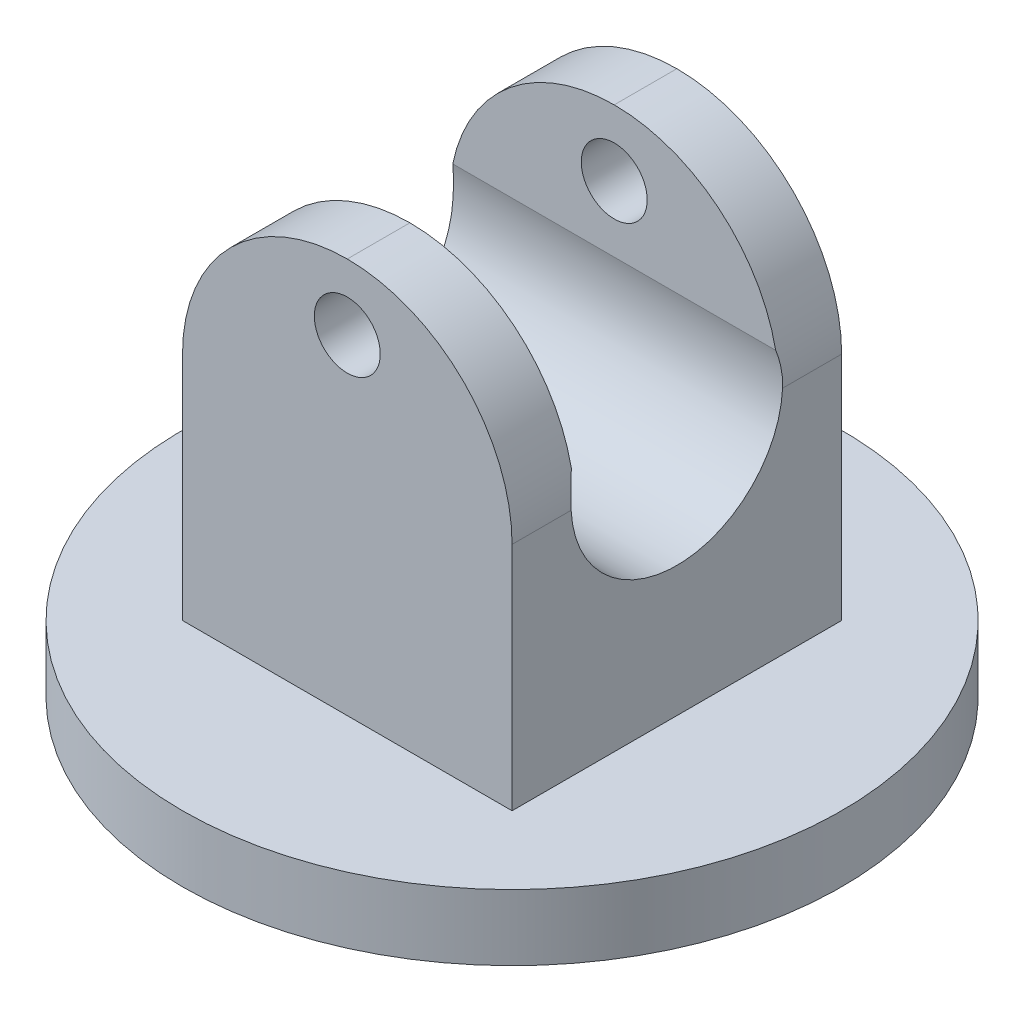
ISO-10303-21;
HEADER;
FILE_DESCRIPTION(('STEP AP214'),'2;1');
FILE_NAME('part.step','',(''),(''),'','','');
FILE_SCHEMA(('AUTOMOTIVE_DESIGN { 1 0 10303 214 1 1 1 1 }'));
ENDSEC;
DATA;
#1=APPLICATION_CONTEXT('core data for automotive mechanical design processes');
#2=APPLICATION_PROTOCOL_DEFINITION('international standard','automotive_design',2000,#1);
#3=PRODUCT_CONTEXT('',#1,'mechanical');
#4=PRODUCT('Part','Part','',(#3));
#5=PRODUCT_RELATED_PRODUCT_CATEGORY('part','',(#4));
#6=PRODUCT_DEFINITION_FORMATION('','',#4);
#7=PRODUCT_DEFINITION_CONTEXT('part definition',#1,'design');
#8=PRODUCT_DEFINITION('design','',#6,#7);
#9=PRODUCT_DEFINITION_SHAPE('','',#8);
#10=(LENGTH_UNIT() NAMED_UNIT(*) SI_UNIT(.MILLI.,.METRE.));
#11=(NAMED_UNIT(*) PLANE_ANGLE_UNIT() SI_UNIT($,.RADIAN.));
#12=(NAMED_UNIT(*) SI_UNIT($,.STERADIAN.) SOLID_ANGLE_UNIT());
#13=UNCERTAINTY_MEASURE_WITH_UNIT(LENGTH_MEASURE(1.E-05),#10,'distance_accuracy_value','');
#14=(GEOMETRIC_REPRESENTATION_CONTEXT(3) GLOBAL_UNCERTAINTY_ASSIGNED_CONTEXT((#13)) GLOBAL_UNIT_ASSIGNED_CONTEXT((#10,
#11,#12)) REPRESENTATION_CONTEXT('',''));
#15=CARTESIAN_POINT('',(0.,0.,0.));
#16=DIRECTION('',(0.,0.,1.));
#17=DIRECTION('',(1.,0.,0.));
#18=AXIS2_PLACEMENT_3D('',#15,#16,#17);
#19=CARTESIAN_POINT('',(0.,10.,0.));
#20=DIRECTION('',(0.,-1.,0.));
#21=DIRECTION('',(0.,0.,-1.));
#22=AXIS2_PLACEMENT_3D('',#19,#20,#21);
#23=CYLINDRICAL_SURFACE('',#22,50.);
#24=CARTESIAN_POINT('',(0.,10.,0.));
#25=DIRECTION('',(0.,1.,0.));
#26=DIRECTION('',(0.,0.,1.));
#27=AXIS2_PLACEMENT_3D('',#24,#25,#26);
#28=CIRCLE('',#27,50.);
#29=CARTESIAN_POINT('',(0.,10.,50.));
#30=VERTEX_POINT('',#29);
#31=EDGE_CURVE('E154',#30,#30,#28,.T.);
#32=ORIENTED_EDGE('',*,*,#31,.F.);
#33=EDGE_LOOP('',(#32));
#34=FACE_BOUND('',#33,.T.);
#35=CARTESIAN_POINT('',(0.,0.,0.));
#36=DIRECTION('',(0.,1.,0.));
#37=DIRECTION('',(0.,0.,1.));
#38=AXIS2_PLACEMENT_3D('',#35,#36,#37);
#39=CIRCLE('',#38,50.);
#40=CARTESIAN_POINT('',(0.,0.,50.));
#41=VERTEX_POINT('',#40);
#42=EDGE_CURVE('E153',#41,#41,#39,.T.);
#43=ORIENTED_EDGE('',*,*,#42,.T.);
#44=EDGE_LOOP('',(#43));
#45=FACE_BOUND('',#44,.T.);
#46=ADVANCED_FACE('F38',(#34,#45),#23,.T.);
#47=CARTESIAN_POINT('',(0.,10.,0.));
#48=DIRECTION('',(0.,1.,0.));
#49=DIRECTION('',(0.,0.,1.));
#50=AXIS2_PLACEMENT_3D('',#47,#48,#49);
#51=PLANE('',#50);
#52=DIRECTION('',(0.,0.,-1.));
#53=VECTOR('',#52,1.);
#54=CARTESIAN_POINT('',(25.,10.,25.));
#55=LINE('',#54,#53);
#56=CARTESIAN_POINT('',(25.,10.,25.));
#57=VERTEX_POINT('',#56);
#58=CARTESIAN_POINT('',(25.,10.,-25.));
#59=VERTEX_POINT('',#58);
#60=EDGE_CURVE('E142',#57,#59,#55,.T.);
#61=ORIENTED_EDGE('',*,*,#60,.F.);
#62=DIRECTION('',(1.,0.,0.));
#63=VECTOR('',#62,1.);
#64=CARTESIAN_POINT('',(-25.,10.,25.));
#65=LINE('',#64,#63);
#66=CARTESIAN_POINT('',(-25.,10.,25.));
#67=VERTEX_POINT('',#66);
#68=EDGE_CURVE('E138',#67,#57,#65,.T.);
#69=ORIENTED_EDGE('',*,*,#68,.F.);
#70=DIRECTION('',(0.,0.,1.));
#71=VECTOR('',#70,1.);
#72=CARTESIAN_POINT('',(-25.,10.,25.));
#73=LINE('',#72,#71);
#74=CARTESIAN_POINT('',(-25.,10.,-25.));
#75=VERTEX_POINT('',#74);
#76=EDGE_CURVE('E121',#75,#67,#73,.T.);
#77=ORIENTED_EDGE('',*,*,#76,.F.);
#78=DIRECTION('',(-1.,0.,0.));
#79=VECTOR('',#78,1.);
#80=CARTESIAN_POINT('',(-25.,10.,-25.));
#81=LINE('',#80,#79);
#82=EDGE_CURVE('E135',#59,#75,#81,.T.);
#83=ORIENTED_EDGE('',*,*,#82,.F.);
#84=EDGE_LOOP('',(#61,#69,#77,#83));
#85=FACE_BOUND('',#84,.T.);
#86=ORIENTED_EDGE('',*,*,#31,.T.);
#87=EDGE_LOOP('',(#86));
#88=FACE_BOUND('',#87,.T.);
#89=ADVANCED_FACE('F133',(#85,#88),#51,.T.);
#90=CARTESIAN_POINT('',(0.,0.,0.));
#91=DIRECTION('',(0.,1.,0.));
#92=DIRECTION('',(0.,0.,1.));
#93=AXIS2_PLACEMENT_3D('',#90,#91,#92);
#94=PLANE('',#93);
#95=ORIENTED_EDGE('',*,*,#42,.F.);
#96=EDGE_LOOP('',(#95));
#97=FACE_BOUND('',#96,.T.);
#98=ADVANCED_FACE('F232',(#97),#94,.F.);
#99=CARTESIAN_POINT('',(25.,70.,25.));
#100=DIRECTION('',(-1.,0.,0.));
#101=DIRECTION('',(0.,0.,1.));
#102=AXIS2_PLACEMENT_3D('',#99,#100,#101);
#103=PLANE('',#102);
#104=CARTESIAN_POINT('',(25.,45.7870017952277,0.));
#105=DIRECTION('',(1.,0.,0.));
#106=DIRECTION('',(0.,0.,-1.));
#107=AXIS2_PLACEMENT_3D('',#104,#105,#106);
#108=CIRCLE('',#107,16.0623582911543);
#109=CARTESIAN_POINT('',(25.,45.,16.0430664789411));
#110=VERTEX_POINT('',#109);
#111=CARTESIAN_POINT('',(25.,45.,-16.0430664789411));
#112=VERTEX_POINT('',#111);
#113=EDGE_CURVE('E264',#110,#112,#108,.T.);
#114=ORIENTED_EDGE('',*,*,#113,.F.);
#115=DIRECTION('',(0.,0.,-1.));
#116=VECTOR('',#115,1.);
#117=CARTESIAN_POINT('',(25.,45.,25.));
#118=LINE('',#117,#116);
#119=CARTESIAN_POINT('',(25.,45.,25.));
#120=VERTEX_POINT('',#119);
#121=EDGE_CURVE('E262',#110,#120,#118,.F.);
#122=ORIENTED_EDGE('',*,*,#121,.T.);
#123=DIRECTION('',(0.,-1.,0.));
#124=VECTOR('',#123,1.);
#125=CARTESIAN_POINT('',(25.,70.,25.));
#126=LINE('',#125,#124);
#127=EDGE_CURVE('E149',#120,#57,#126,.T.);
#128=ORIENTED_EDGE('',*,*,#127,.T.);
#129=ORIENTED_EDGE('',*,*,#60,.T.);
#130=DIRECTION('',(0.,-1.,0.));
#131=VECTOR('',#130,1.);
#132=CARTESIAN_POINT('',(25.,70.,-25.));
#133=LINE('',#132,#131);
#134=CARTESIAN_POINT('',(25.,45.,-25.));
#135=VERTEX_POINT('',#134);
#136=EDGE_CURVE('E126',#135,#59,#133,.T.);
#137=ORIENTED_EDGE('',*,*,#136,.F.);
#138=DIRECTION('',(0.,0.,-1.));
#139=VECTOR('',#138,1.);
#140=CARTESIAN_POINT('',(25.,45.,25.));
#141=LINE('',#140,#139);
#142=EDGE_CURVE('E268',#135,#112,#141,.F.);
#143=ORIENTED_EDGE('',*,*,#142,.T.);
#144=EDGE_LOOP('',(#114,#122,#128,#129,#137,#143));
#145=FACE_BOUND('',#144,.T.);
#146=ADVANCED_FACE('F238',(#145),#103,.F.);
#147=CARTESIAN_POINT('',(-25.,70.,-25.));
#148=DIRECTION('',(0.,0.,1.));
#149=DIRECTION('',(1.,0.,0.));
#150=AXIS2_PLACEMENT_3D('',#147,#148,#149);
#151=PLANE('',#150);
#152=CARTESIAN_POINT('',(0.,60.,-25.));
#153=DIRECTION('',(0.,0.,1.));
#154=DIRECTION('',(1.,0.,0.));
#155=AXIS2_PLACEMENT_3D('',#152,#153,#154);
#156=CIRCLE('',#155,5.);
#157=CARTESIAN_POINT('',(5.,60.,-25.));
#158=VERTEX_POINT('',#157);
#159=EDGE_CURVE('E290',#158,#158,#156,.T.);
#160=ORIENTED_EDGE('',*,*,#159,.T.);
#161=EDGE_LOOP('',(#160));
#162=FACE_BOUND('',#161,.T.);
#163=DIRECTION('',(0.,-1.,0.));
#164=VECTOR('',#163,1.);
#165=CARTESIAN_POINT('',(-25.,70.,-25.));
#166=LINE('',#165,#164);
#167=CARTESIAN_POINT('',(-25.,45.,-25.));
#168=VERTEX_POINT('',#167);
#169=EDGE_CURVE('E117',#168,#75,#166,.T.);
#170=ORIENTED_EDGE('',*,*,#169,.F.);
#171=CARTESIAN_POINT('',(0.,45.,-25.));
#172=DIRECTION('',(0.,0.,1.));
#173=DIRECTION('',(1.,0.,0.));
#174=AXIS2_PLACEMENT_3D('',#171,#172,#173);
#175=CIRCLE('',#174,25.);
#176=CARTESIAN_POINT('',(0.,70.,-25.));
#177=VERTEX_POINT('',#176);
#178=EDGE_CURVE('E11',#168,#177,#175,.F.);
#179=ORIENTED_EDGE('',*,*,#178,.T.);
#180=CARTESIAN_POINT('',(0.,45.,-25.));
#181=DIRECTION('',(0.,0.,1.));
#182=DIRECTION('',(1.,0.,0.));
#183=AXIS2_PLACEMENT_3D('',#180,#181,#182);
#184=CIRCLE('',#183,25.);
#185=EDGE_CURVE('E48',#177,#135,#184,.F.);
#186=ORIENTED_EDGE('',*,*,#185,.T.);
#187=ORIENTED_EDGE('',*,*,#136,.T.);
#188=ORIENTED_EDGE('',*,*,#82,.T.);
#189=EDGE_LOOP('',(#170,#179,#186,#187,#188));
#190=FACE_BOUND('',#189,.T.);
#191=ADVANCED_FACE('F140',(#162,#190),#151,.F.);
#192=CARTESIAN_POINT('',(-25.,70.,25.));
#193=DIRECTION('',(1.,0.,0.));
#194=DIRECTION('',(0.,0.,-1.));
#195=AXIS2_PLACEMENT_3D('',#192,#193,#194);
#196=PLANE('',#195);
#197=DIRECTION('',(0.,-1.,0.));
#198=VECTOR('',#197,1.);
#199=CARTESIAN_POINT('',(-25.,70.,25.));
#200=LINE('',#199,#198);
#201=CARTESIAN_POINT('',(-25.,45.,25.));
#202=VERTEX_POINT('',#201);
#203=EDGE_CURVE('E127',#202,#67,#200,.T.);
#204=ORIENTED_EDGE('',*,*,#203,.F.);
#205=DIRECTION('',(0.,0.,1.));
#206=VECTOR('',#205,1.);
#207=CARTESIAN_POINT('',(-25.,45.,25.));
#208=LINE('',#207,#206);
#209=CARTESIAN_POINT('',(-25.,45.,16.0430664789411));
#210=VERTEX_POINT('',#209);
#211=EDGE_CURVE('E274',#202,#210,#208,.F.);
#212=ORIENTED_EDGE('',*,*,#211,.T.);
#213=CARTESIAN_POINT('',(-25.,45.7870017952277,0.));
#214=DIRECTION('',(1.,0.,0.));
#215=DIRECTION('',(0.,0.,-1.));
#216=AXIS2_PLACEMENT_3D('',#213,#214,#215);
#217=CIRCLE('',#216,16.0623582911543);
#218=CARTESIAN_POINT('',(-25.,45.,-16.0430664789411));
#219=VERTEX_POINT('',#218);
#220=EDGE_CURVE('E157',#210,#219,#217,.T.);
#221=ORIENTED_EDGE('',*,*,#220,.T.);
#222=DIRECTION('',(0.,0.,1.));
#223=VECTOR('',#222,1.);
#224=CARTESIAN_POINT('',(-25.,45.,25.));
#225=LINE('',#224,#223);
#226=EDGE_CURVE('E124',#219,#168,#225,.F.);
#227=ORIENTED_EDGE('',*,*,#226,.T.);
#228=ORIENTED_EDGE('',*,*,#169,.T.);
#229=ORIENTED_EDGE('',*,*,#76,.T.);
#230=EDGE_LOOP('',(#204,#212,#221,#227,#228,#229));
#231=FACE_BOUND('',#230,.T.);
#232=ADVANCED_FACE('F120',(#231),#196,.F.);
#233=CARTESIAN_POINT('',(-25.,70.,25.));
#234=DIRECTION('',(0.,0.,-1.));
#235=DIRECTION('',(-1.,0.,0.));
#236=AXIS2_PLACEMENT_3D('',#233,#234,#235);
#237=PLANE('',#236);
#238=CARTESIAN_POINT('',(0.,60.,25.));
#239=DIRECTION('',(0.,0.,-1.));
#240=DIRECTION('',(-1.,0.,0.));
#241=AXIS2_PLACEMENT_3D('',#238,#239,#240);
#242=CIRCLE('',#241,5.);
#243=CARTESIAN_POINT('',(-5.,60.,25.));
#244=VERTEX_POINT('',#243);
#245=EDGE_CURVE('E255',#244,#244,#242,.T.);
#246=ORIENTED_EDGE('',*,*,#245,.T.);
#247=EDGE_LOOP('',(#246));
#248=FACE_BOUND('',#247,.T.);
#249=ORIENTED_EDGE('',*,*,#127,.F.);
#250=CARTESIAN_POINT('',(0.,45.,25.));
#251=DIRECTION('',(0.,0.,-1.));
#252=DIRECTION('',(-1.,0.,0.));
#253=AXIS2_PLACEMENT_3D('',#250,#251,#252);
#254=CIRCLE('',#253,25.);
#255=CARTESIAN_POINT('',(0.,70.,25.));
#256=VERTEX_POINT('',#255);
#257=EDGE_CURVE('E257',#120,#256,#254,.F.);
#258=ORIENTED_EDGE('',*,*,#257,.T.);
#259=CARTESIAN_POINT('',(0.,45.,25.));
#260=DIRECTION('',(0.,0.,-1.));
#261=DIRECTION('',(-1.,0.,0.));
#262=AXIS2_PLACEMENT_3D('',#259,#260,#261);
#263=CIRCLE('',#262,25.);
#264=EDGE_CURVE('E267',#256,#202,#263,.F.);
#265=ORIENTED_EDGE('',*,*,#264,.T.);
#266=ORIENTED_EDGE('',*,*,#203,.T.);
#267=ORIENTED_EDGE('',*,*,#68,.T.);
#268=EDGE_LOOP('',(#249,#258,#265,#266,#267));
#269=FACE_BOUND('',#268,.T.);
#270=ADVANCED_FACE('F189',(#248,#269),#237,.F.);
#271=CARTESIAN_POINT('',(-50.,45.7870017952277,0.));
#272=DIRECTION('',(1.,0.,0.));
#273=DIRECTION('',(0.,0.,-1.));
#274=AXIS2_PLACEMENT_3D('',#271,#272,#273);
#275=CYLINDRICAL_SURFACE('',#274,16.0623582911543);
#276=DIRECTION('',(1.,0.,0.));
#277=VECTOR('',#276,1.);
#278=CARTESIAN_POINT('',(-50.,50.,15.5));
#279=LINE('',#278,#277);
#280=CARTESIAN_POINT('',(-24.4948974278318,50.,15.5));
#281=VERTEX_POINT('',#280);
#282=CARTESIAN_POINT('',(24.4948974278318,50.,15.5));
#283=VERTEX_POINT('',#282);
#284=EDGE_CURVE('E289',#281,#283,#279,.T.);
#285=ORIENTED_EDGE('',*,*,#284,.T.);
#286=CARTESIAN_POINT('',(24.4948974278318,50.,15.5));
#287=CARTESIAN_POINT('',(24.5360080640604,49.7986122084649,15.5547396782245));
#288=CARTESIAN_POINT('',(24.5748283702396,49.5957421163059,15.605664148144));
#289=CARTESIAN_POINT('',(24.6477015240305,49.1873411012421,15.6997121700656));
#290=CARTESIAN_POINT('',(24.6817540512124,48.9818100005111,15.7428351978105));
#291=CARTESIAN_POINT('',(24.7759211197461,48.3653275162349,15.8595533869517));
#292=CARTESIAN_POINT('',(24.8287682026249,47.9509621887126,15.9214574760126));
#293=CARTESIAN_POINT('',(24.9137766829401,47.1165054533366,16.0127424421074));
#294=CARTESIAN_POINT('',(24.9459365230118,46.6964136168137,16.042120870684));
#295=CARTESIAN_POINT('',(24.9782961585118,46.0630225915213,16.0613935270315));
#296=CARTESIAN_POINT('',(24.9864362736,45.8504218569248,16.063640322793));
#297=CARTESIAN_POINT('',(24.9972901245615,45.4251546226323,16.0596900891298));
#298=CARTESIAN_POINT('',(25.0000037122856,45.2124881212993,16.0534928291823));
#299=CARTESIAN_POINT('',(25.,45.,16.0430664789411));
#300=B_SPLINE_CURVE_WITH_KNOTS('',3,(#286,#287,#288,#289,#290,#291,#292,#293,#294,#295,#296,
#297,#298,#299),.UNSPECIFIED.,.F.,.F.,(4,2,2,2,2,2,4),(0.,0.638018474818265,1.27607980858665,
2.54107185784011,3.80615912632551,4.44425585207834,5.08236999822523),.UNSPECIFIED.);
#301=EDGE_CURVE('E204',#283,#110,#300,.T.);
#302=ORIENTED_EDGE('',*,*,#301,.T.);
#303=ORIENTED_EDGE('',*,*,#113,.T.);
#304=CARTESIAN_POINT('',(25.,45.,-16.0430664789411));
#305=CARTESIAN_POINT('',(25.0000037122856,45.2124881212993,-16.0534928291823));
#306=CARTESIAN_POINT('',(24.9972901245615,45.4251546226323,-16.0596900891298));
#307=CARTESIAN_POINT('',(24.9864362736,45.8504218569248,-16.063640322793));
#308=CARTESIAN_POINT('',(24.9782961585118,46.0630225915213,-16.0613935270315));
#309=CARTESIAN_POINT('',(24.9459365230118,46.6964136168137,-16.042120870684));
#310=CARTESIAN_POINT('',(24.9137766829401,47.1165054533366,-16.0127424421074));
#311=CARTESIAN_POINT('',(24.8287682026249,47.9509621887126,-15.9214574760126));
#312=CARTESIAN_POINT('',(24.7759211197461,48.3653275162349,-15.8595533869517));
#313=CARTESIAN_POINT('',(24.6817540512124,48.9818100005111,-15.7428351978105));
#314=CARTESIAN_POINT('',(24.6477015240305,49.1873411012421,-15.6997121700656));
#315=CARTESIAN_POINT('',(24.5748283702396,49.5957421163059,-15.605664148144));
#316=CARTESIAN_POINT('',(24.5360080640604,49.7986122084649,-15.5547396782245));
#317=CARTESIAN_POINT('',(24.4948974278318,50.,-15.5));
#318=B_SPLINE_CURVE_WITH_KNOTS('',3,(#304,#305,#306,#307,#308,#309,#310,#311,#312,#313,#314,
#315,#316,#317),.UNSPECIFIED.,.F.,.F.,(4,2,2,2,2,2,4),(0.,0.638114146146888,1.27621087189971,
2.54129814038511,3.80629018963856,4.44435152340695,5.08236999822522),.UNSPECIFIED.);
#319=CARTESIAN_POINT('',(24.4948974278318,50.,-15.5));
#320=VERTEX_POINT('',#319);
#321=EDGE_CURVE('E170',#112,#320,#318,.T.);
#322=ORIENTED_EDGE('',*,*,#321,.T.);
#323=DIRECTION('',(1.,0.,0.));
#324=VECTOR('',#323,1.);
#325=CARTESIAN_POINT('',(-50.,50.,-15.5));
#326=LINE('',#325,#324);
#327=CARTESIAN_POINT('',(-24.4948974278318,50.,-15.5));
#328=VERTEX_POINT('',#327);
#329=EDGE_CURVE('E144',#328,#320,#326,.T.);
#330=ORIENTED_EDGE('',*,*,#329,.F.);
#331=CARTESIAN_POINT('',(-24.4948974278318,50.,-15.5));
#332=CARTESIAN_POINT('',(-24.5360080640604,49.7986122084649,-15.5547396782245));
#333=CARTESIAN_POINT('',(-24.5748283702396,49.5957421163059,-15.605664148144));
#334=CARTESIAN_POINT('',(-24.6477015240305,49.1873411012421,-15.6997121700656));
#335=CARTESIAN_POINT('',(-24.6817540512124,48.9818100005111,-15.7428351978105));
#336=CARTESIAN_POINT('',(-24.7759211197461,48.3653275162349,-15.8595533869517));
#337=CARTESIAN_POINT('',(-24.8287682026249,47.9509621887126,-15.9214574760126));
#338=CARTESIAN_POINT('',(-24.9137766829401,47.1165054533366,-16.0127424421074));
#339=CARTESIAN_POINT('',(-24.9459365230118,46.6964136168137,-16.042120870684));
#340=CARTESIAN_POINT('',(-24.9782961585118,46.0630225915213,-16.0613935270315));
#341=CARTESIAN_POINT('',(-24.9864362736,45.8504218569248,-16.063640322793));
#342=CARTESIAN_POINT('',(-24.9972901245615,45.4251546226323,-16.0596900891298));
#343=CARTESIAN_POINT('',(-25.0000037122856,45.2124881212993,-16.0534928291823));
#344=CARTESIAN_POINT('',(-25.,45.,-16.0430664789411));
#345=B_SPLINE_CURVE_WITH_KNOTS('',3,(#331,#332,#333,#334,#335,#336,#337,#338,#339,#340,#341,
#342,#343,#344),.UNSPECIFIED.,.F.,.F.,(4,2,2,2,2,2,4),(0.,0.638018474818271,1.27607980858665,
2.54107185784011,3.8061591263255,4.44425585207833,5.08236999822522),.UNSPECIFIED.);
#346=EDGE_CURVE('E177',#328,#219,#345,.T.);
#347=ORIENTED_EDGE('',*,*,#346,.T.);
#348=ORIENTED_EDGE('',*,*,#220,.F.);
#349=CARTESIAN_POINT('',(-25.,45.,16.0430664789411));
#350=CARTESIAN_POINT('',(-25.0000037122856,45.2124881212993,16.0534928291823));
#351=CARTESIAN_POINT('',(-24.9972901245615,45.4251546226323,16.0596900891298));
#352=CARTESIAN_POINT('',(-24.9864362736,45.8504218569248,16.063640322793));
#353=CARTESIAN_POINT('',(-24.9782961585118,46.0630225915213,16.0613935270315));
#354=CARTESIAN_POINT('',(-24.9459365230118,46.6964136168137,16.042120870684));
#355=CARTESIAN_POINT('',(-24.9137766829401,47.1165054533366,16.0127424421074));
#356=CARTESIAN_POINT('',(-24.8287682026249,47.9509621887126,15.9214574760126));
#357=CARTESIAN_POINT('',(-24.7759211197461,48.3653275162349,15.8595533869517));
#358=CARTESIAN_POINT('',(-24.6817540512124,48.9818100005111,15.7428351978105));
#359=CARTESIAN_POINT('',(-24.6477015240305,49.1873411012421,15.6997121700656));
#360=CARTESIAN_POINT('',(-24.5748283702396,49.5957421163059,15.605664148144));
#361=CARTESIAN_POINT('',(-24.5360080640604,49.7986122084649,15.5547396782245));
#362=CARTESIAN_POINT('',(-24.4948974278318,50.,15.5));
#363=B_SPLINE_CURVE_WITH_KNOTS('',3,(#349,#350,#351,#352,#353,#354,#355,#356,#357,#358,#359,
#360,#361,#362),.UNSPECIFIED.,.F.,.F.,(4,2,2,2,2,2,4),(0.,0.638114146146888,1.27621087189971,
2.54129814038511,3.80629018963856,4.44435152340695,5.08236999822522),.UNSPECIFIED.);
#364=EDGE_CURVE('E198',#210,#281,#363,.T.);
#365=ORIENTED_EDGE('',*,*,#364,.T.);
#366=EDGE_LOOP('',(#285,#302,#303,#322,#330,#347,#348,#365));
#367=FACE_BOUND('',#366,.T.);
#368=ADVANCED_FACE('F183',(#367),#275,.F.);
#369=CARTESIAN_POINT('',(-50.,70.,15.5));
#370=DIRECTION('',(0.,0.,1.));
#371=DIRECTION('',(1.,0.,0.));
#372=AXIS2_PLACEMENT_3D('',#369,#370,#371);
#373=PLANE('',#372);
#374=CARTESIAN_POINT('',(0.,60.,15.5));
#375=DIRECTION('',(0.,0.,1.));
#376=DIRECTION('',(1.,0.,0.));
#377=AXIS2_PLACEMENT_3D('',#374,#375,#376);
#378=CIRCLE('',#377,5.);
#379=CARTESIAN_POINT('',(5.,60.,15.5));
#380=VERTEX_POINT('',#379);
#381=EDGE_CURVE('E165',#380,#380,#378,.T.);
#382=ORIENTED_EDGE('',*,*,#381,.T.);
#383=EDGE_LOOP('',(#382));
#384=FACE_BOUND('',#383,.T.);
#385=CARTESIAN_POINT('',(0.,45.,15.5));
#386=DIRECTION('',(0.,0.,1.));
#387=DIRECTION('',(1.,0.,0.));
#388=AXIS2_PLACEMENT_3D('',#385,#386,#387);
#389=CIRCLE('',#388,25.);
#390=CARTESIAN_POINT('',(0.,70.,15.5));
#391=VERTEX_POINT('',#390);
#392=EDGE_CURVE('E161',#281,#391,#389,.F.);
#393=ORIENTED_EDGE('',*,*,#392,.T.);
#394=CARTESIAN_POINT('',(0.,45.,15.5));
#395=DIRECTION('',(0.,0.,1.));
#396=DIRECTION('',(1.,0.,0.));
#397=AXIS2_PLACEMENT_3D('',#394,#395,#396);
#398=CIRCLE('',#397,25.);
#399=EDGE_CURVE('E168',#391,#283,#398,.F.);
#400=ORIENTED_EDGE('',*,*,#399,.T.);
#401=ORIENTED_EDGE('',*,*,#284,.F.);
#402=EDGE_LOOP('',(#393,#400,#401));
#403=FACE_BOUND('',#402,.T.);
#404=ADVANCED_FACE('F188',(#384,#403),#373,.F.);
#405=CARTESIAN_POINT('',(-50.,50.,-15.5));
#406=DIRECTION('',(0.,0.,-1.));
#407=DIRECTION('',(0.,1.,0.));
#408=AXIS2_PLACEMENT_3D('',#405,#406,#407);
#409=PLANE('',#408);
#410=CARTESIAN_POINT('',(0.,60.,-15.5));
#411=DIRECTION('',(0.,0.,-1.));
#412=DIRECTION('',(0.,1.,0.));
#413=AXIS2_PLACEMENT_3D('',#410,#411,#412);
#414=CIRCLE('',#413,5.);
#415=CARTESIAN_POINT('',(0.,65.,-15.5));
#416=VERTEX_POINT('',#415);
#417=EDGE_CURVE('E162',#416,#416,#414,.T.);
#418=ORIENTED_EDGE('',*,*,#417,.T.);
#419=EDGE_LOOP('',(#418));
#420=FACE_BOUND('',#419,.T.);
#421=CARTESIAN_POINT('',(0.,45.,-15.5));
#422=DIRECTION('',(0.,0.,-1.));
#423=DIRECTION('',(0.,1.,0.));
#424=AXIS2_PLACEMENT_3D('',#421,#422,#423);
#425=CIRCLE('',#424,25.);
#426=CARTESIAN_POINT('',(0.,70.,-15.5));
#427=VERTEX_POINT('',#426);
#428=EDGE_CURVE('E62',#320,#427,#425,.F.);
#429=ORIENTED_EDGE('',*,*,#428,.T.);
#430=CARTESIAN_POINT('',(0.,45.,-15.5));
#431=DIRECTION('',(0.,0.,-1.));
#432=DIRECTION('',(0.,1.,0.));
#433=AXIS2_PLACEMENT_3D('',#430,#431,#432);
#434=CIRCLE('',#433,25.);
#435=EDGE_CURVE('E277',#427,#328,#434,.F.);
#436=ORIENTED_EDGE('',*,*,#435,.T.);
#437=ORIENTED_EDGE('',*,*,#329,.T.);
#438=EDGE_LOOP('',(#429,#436,#437));
#439=FACE_BOUND('',#438,.T.);
#440=ADVANCED_FACE('F191',(#420,#439),#409,.F.);
#441=CARTESIAN_POINT('',(0.,60.,-50.));
#442=DIRECTION('',(0.,0.,1.));
#443=DIRECTION('',(1.,0.,0.));
#444=AXIS2_PLACEMENT_3D('',#441,#442,#443);
#445=CYLINDRICAL_SURFACE('',#444,5.);
#446=ORIENTED_EDGE('',*,*,#417,.F.);
#447=EDGE_LOOP('',(#446));
#448=FACE_BOUND('',#447,.T.);
#449=ORIENTED_EDGE('',*,*,#159,.F.);
#450=EDGE_LOOP('',(#449));
#451=FACE_BOUND('',#450,.T.);
#452=ADVANCED_FACE('F337',(#448,#451),#445,.F.);
#453=ORIENTED_EDGE('',*,*,#381,.F.);
#454=EDGE_LOOP('',(#453));
#455=FACE_BOUND('',#454,.T.);
#456=ORIENTED_EDGE('',*,*,#245,.F.);
#457=EDGE_LOOP('',(#456));
#458=FACE_BOUND('',#457,.T.);
#459=ADVANCED_FACE('F215',(#455,#458),#445,.F.);
#460=CARTESIAN_POINT('',(0.,45.,0.));
#461=DIRECTION('',(0.,0.,1.));
#462=DIRECTION('',(1.,0.,0.));
#463=AXIS2_PLACEMENT_3D('',#460,#461,#462);
#464=CYLINDRICAL_SURFACE('',#463,25.);
#465=ORIENTED_EDGE('',*,*,#211,.F.);
#466=ORIENTED_EDGE('',*,*,#264,.F.);
#467=DIRECTION('',(0.,0.,1.));
#468=VECTOR('',#467,1.);
#469=CARTESIAN_POINT('',(0.,70.,0.));
#470=LINE('',#469,#468);
#471=EDGE_CURVE('E166',#391,#256,#470,.T.);
#472=ORIENTED_EDGE('',*,*,#471,.F.);
#473=ORIENTED_EDGE('',*,*,#392,.F.);
#474=ORIENTED_EDGE('',*,*,#364,.F.);
#475=EDGE_LOOP('',(#465,#466,#472,#473,#474));
#476=FACE_BOUND('',#475,.T.);
#477=ADVANCED_FACE('F211',(#476),#464,.T.);
#478=CARTESIAN_POINT('',(0.,45.,0.));
#479=DIRECTION('',(0.,0.,-1.));
#480=DIRECTION('',(-1.,0.,0.));
#481=AXIS2_PLACEMENT_3D('',#478,#479,#480);
#482=CYLINDRICAL_SURFACE('',#481,25.);
#483=ORIENTED_EDGE('',*,*,#257,.F.);
#484=ORIENTED_EDGE('',*,*,#121,.F.);
#485=ORIENTED_EDGE('',*,*,#301,.F.);
#486=ORIENTED_EDGE('',*,*,#399,.F.);
#487=ORIENTED_EDGE('',*,*,#471,.T.);
#488=EDGE_LOOP('',(#483,#484,#485,#486,#487));
#489=FACE_BOUND('',#488,.T.);
#490=ADVANCED_FACE('F214',(#489),#482,.T.);
#491=CARTESIAN_POINT('',(0.,45.,0.));
#492=DIRECTION('',(0.,0.,-1.));
#493=DIRECTION('',(-1.,0.,0.));
#494=AXIS2_PLACEMENT_3D('',#491,#492,#493);
#495=CYLINDRICAL_SURFACE('',#494,25.);
#496=ORIENTED_EDGE('',*,*,#142,.F.);
#497=ORIENTED_EDGE('',*,*,#185,.F.);
#498=DIRECTION('',(0.,0.,-1.));
#499=VECTOR('',#498,1.);
#500=CARTESIAN_POINT('',(0.,70.,0.));
#501=LINE('',#500,#499);
#502=EDGE_CURVE('E43',#427,#177,#501,.T.);
#503=ORIENTED_EDGE('',*,*,#502,.F.);
#504=ORIENTED_EDGE('',*,*,#428,.F.);
#505=ORIENTED_EDGE('',*,*,#321,.F.);
#506=EDGE_LOOP('',(#496,#497,#503,#504,#505));
#507=FACE_BOUND('',#506,.T.);
#508=ADVANCED_FACE('F40',(#507),#495,.T.);
#509=CARTESIAN_POINT('',(0.,45.,0.));
#510=DIRECTION('',(0.,0.,1.));
#511=DIRECTION('',(1.,0.,0.));
#512=AXIS2_PLACEMENT_3D('',#509,#510,#511);
#513=CYLINDRICAL_SURFACE('',#512,25.);
#514=ORIENTED_EDGE('',*,*,#178,.F.);
#515=ORIENTED_EDGE('',*,*,#226,.F.);
#516=ORIENTED_EDGE('',*,*,#346,.F.);
#517=ORIENTED_EDGE('',*,*,#435,.F.);
#518=ORIENTED_EDGE('',*,*,#502,.T.);
#519=EDGE_LOOP('',(#514,#515,#516,#517,#518));
#520=FACE_BOUND('',#519,.T.);
#521=ADVANCED_FACE('F219',(#520),#513,.T.);
#522=CLOSED_SHELL('',(#46,#89,#98,#146,#191,#232,#270,#368,#404,#440,#452,#459,#477,#490,#508,#521));
#523=MANIFOLD_SOLID_BREP('B2',#522);
#524=ADVANCED_BREP_SHAPE_REPRESENTATION('',(#18,#523),#14);
#525=SHAPE_DEFINITION_REPRESENTATION(#9,#524);
ENDSEC;
END-ISO-10303-21;
